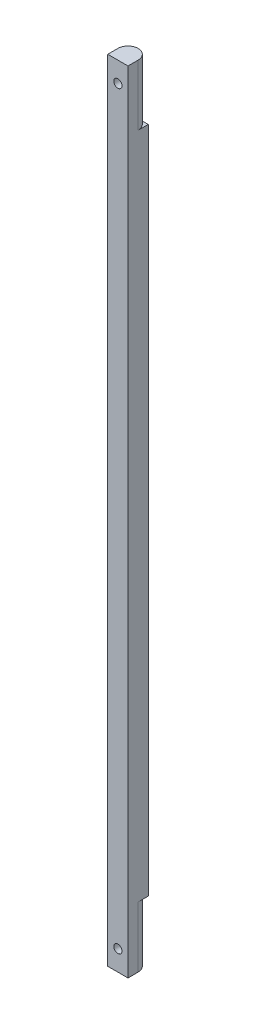
ISO-10303-21;
HEADER;
FILE_DESCRIPTION(('STEP AP214'),'2;1');
FILE_NAME('part.step','',(''),(''),'','','');
FILE_SCHEMA(('AUTOMOTIVE_DESIGN { 1 0 10303 214 1 1 1 1 }'));
ENDSEC;
DATA;
#1=APPLICATION_CONTEXT('core data for automotive mechanical design processes');
#2=APPLICATION_PROTOCOL_DEFINITION('international standard','automotive_design',2000,#1);
#3=PRODUCT_CONTEXT('',#1,'mechanical');
#4=PRODUCT('Part','Part','',(#3));
#5=PRODUCT_RELATED_PRODUCT_CATEGORY('part','',(#4));
#6=PRODUCT_DEFINITION_FORMATION('','',#4);
#7=PRODUCT_DEFINITION_CONTEXT('part definition',#1,'design');
#8=PRODUCT_DEFINITION('design','',#6,#7);
#9=PRODUCT_DEFINITION_SHAPE('','',#8);
#10=(LENGTH_UNIT() NAMED_UNIT(*) SI_UNIT(.MILLI.,.METRE.));
#11=(NAMED_UNIT(*) PLANE_ANGLE_UNIT() SI_UNIT($,.RADIAN.));
#12=(NAMED_UNIT(*) SI_UNIT($,.STERADIAN.) SOLID_ANGLE_UNIT());
#13=UNCERTAINTY_MEASURE_WITH_UNIT(LENGTH_MEASURE(1.E-05),#10,'distance_accuracy_value','');
#14=(GEOMETRIC_REPRESENTATION_CONTEXT(3) GLOBAL_UNCERTAINTY_ASSIGNED_CONTEXT((#13)) GLOBAL_UNIT_ASSIGNED_CONTEXT((#10,
#11,#12)) REPRESENTATION_CONTEXT('',''));
#15=CARTESIAN_POINT('',(0.,0.,0.));
#16=DIRECTION('',(0.,0.,1.));
#17=DIRECTION('',(1.,0.,0.));
#18=AXIS2_PLACEMENT_3D('',#15,#16,#17);
#19=CARTESIAN_POINT('',(0.,123.825,-3.175));
#20=DIRECTION('',(0.,-1.,0.));
#21=DIRECTION('',(0.,0.,-1.));
#22=AXIS2_PLACEMENT_3D('',#19,#20,#21);
#23=CYLINDRICAL_SURFACE('',#22,3.175);
#24=CARTESIAN_POINT('',(0.,116.18595,-6.35));
#25=CARTESIAN_POINT('',(0.0691991170808229,116.185956788068,-6.34999494878284));
#26=CARTESIAN_POINT('',(0.138514448645238,116.191555341976,-6.34771128002319));
#27=CARTESIAN_POINT('',(0.275187458737668,116.213754018676,-6.33879808003825));
#28=CARTESIAN_POINT('',(0.342539383129636,116.230383631502,-6.33215690011809));
#29=CARTESIAN_POINT('',(0.473087021310062,116.273935839912,-6.31524364494565));
#30=CARTESIAN_POINT('',(0.536295708180401,116.300824312642,-6.30498361510931));
#31=CARTESIAN_POINT('',(0.657246364636683,116.363993653507,-6.28183907891045));
#32=CARTESIAN_POINT('',(0.714990136684526,116.400271409981,-6.26895544232704));
#33=CARTESIAN_POINT('',(0.826242629051796,116.48303798756,-6.24116693926225));
#34=CARTESIAN_POINT('',(0.879453289167616,116.529905806007,-6.22619808843745));
#35=CARTESIAN_POINT('',(0.977512911869515,116.631721710038,-6.19621300876413));
#36=CARTESIAN_POINT('',(1.02235767455051,116.686673829532,-6.18119675994665));
#37=CARTESIAN_POINT('',(1.10445361995858,116.806176975847,-6.15204466177736));
#38=CARTESIAN_POINT('',(1.14125872964486,116.871053999478,-6.13798144758871));
#39=CARTESIAN_POINT('',(1.20330090876947,117.006733466404,-6.11333536275321));
#40=CARTESIAN_POINT('',(1.22854363847174,117.077532990269,-6.10275078988582));
#41=CARTESIAN_POINT('',(1.26552995014933,117.219620296577,-6.08694932324813));
#42=CARTESIAN_POINT('',(1.27784529118986,117.290733156439,-6.08150625748732));
#43=CARTESIAN_POINT('',(1.29041253820246,117.434208322782,-6.07595030426477));
#44=CARTESIAN_POINT('',(1.29067062652423,117.506569969908,-6.07583468515811));
#45=CARTESIAN_POINT('',(1.27954838927626,117.644924216132,-6.08075429064617));
#46=CARTESIAN_POINT('',(1.26900566717996,117.710999922727,-6.08541882210552));
#47=CARTESIAN_POINT('',(1.23798066165121,117.840347861588,-6.0987494612119));
#48=CARTESIAN_POINT('',(1.21749658508013,117.903619585847,-6.10741629074641));
#49=CARTESIAN_POINT('',(1.16677664432287,118.027116233062,-6.12796740817153));
#50=CARTESIAN_POINT('',(1.13634738556802,118.087250778693,-6.13991468325851));
#51=CARTESIAN_POINT('',(1.06673695185948,118.201785820865,-6.16566416352443));
#52=CARTESIAN_POINT('',(1.02755242891495,118.256184112133,-6.17946707748857));
#53=CARTESIAN_POINT('',(0.937867550666348,118.362273896899,-6.20871449812304));
#54=CARTESIAN_POINT('',(0.886713453390287,118.413402375971,-6.22420207670568));
#55=CARTESIAN_POINT('',(0.776396004733478,118.506538369481,-6.25413921024311));
#56=CARTESIAN_POINT('',(0.717230965144648,118.548543956509,-6.2685885454157));
#57=CARTESIAN_POINT('',(0.590933707198551,118.623011119083,-6.29520310800086));
#58=CARTESIAN_POINT('',(0.523660769986689,118.655254776155,-6.30731426034368));
#59=CARTESIAN_POINT('',(0.384028809868175,118.707772211686,-6.327476877027));
#60=CARTESIAN_POINT('',(0.311672473755064,118.728052260945,-6.33553046784028));
#61=CARTESIAN_POINT('',(0.168641898681412,118.754914035715,-6.34627953592641));
#62=CARTESIAN_POINT('',(0.0981318255811727,118.762252010128,-6.34927037549045));
#63=CARTESIAN_POINT('',(-0.0431691778579922,118.765262047857,-6.35049175469347));
#64=CARTESIAN_POINT('',(-0.113960027542253,118.760937248841,-6.34872357466488));
#65=CARTESIAN_POINT('',(-0.250344995389924,118.741295473728,-6.34081834382161));
#66=CARTESIAN_POINT('',(-0.316027571427211,118.726499988219,-6.33488866781712));
#67=CARTESIAN_POINT('',(-0.443913481919017,118.687052163847,-6.31947407528921));
#68=CARTESIAN_POINT('',(-0.506116370652858,118.662398565518,-6.30998870450208));
#69=CARTESIAN_POINT('',(-0.627434557573657,118.603128626758,-6.28801625437917));
#70=CARTESIAN_POINT('',(-0.686395814260261,118.568228899906,-6.27544574313742));
#71=CARTESIAN_POINT('',(-0.79783382236026,118.489770625462,-6.24865843400418));
#72=CARTESIAN_POINT('',(-0.850307918909783,118.446208551713,-6.23444096667786));
#73=CARTESIAN_POINT('',(-0.951026543140727,118.348192421997,-6.20470562715203));
#74=CARTESIAN_POINT('',(-0.998741114888621,118.293199271231,-6.18916505256559));
#75=CARTESIAN_POINT('',(-1.08440104458421,118.175720856224,-6.15941967611857));
#76=CARTESIAN_POINT('',(-1.12234458519762,118.113234201413,-6.1452151230588));
#77=CARTESIAN_POINT('',(-1.18768318457142,117.981480569898,-6.11970431782529));
#78=CARTESIAN_POINT('',(-1.21495482686029,117.912145249523,-6.10843245344576));
#79=CARTESIAN_POINT('',(-1.25721698429187,117.769268559694,-6.09057314753681));
#80=CARTESIAN_POINT('',(-1.2722169384638,117.69573046956,-6.08398210616891));
#81=CARTESIAN_POINT('',(-1.28859508015926,117.552382904157,-6.07676160650549));
#82=CARTESIAN_POINT('',(-1.2908967198223,117.482698691789,-6.07572814139085));
#83=CARTESIAN_POINT('',(-1.28425228510169,117.343983779239,-6.07867601428325));
#84=CARTESIAN_POINT('',(-1.27530773909969,117.274952991539,-6.08265667086014));
#85=CARTESIAN_POINT('',(-1.24718689304565,117.142479218033,-6.09482321951612));
#86=CARTESIAN_POINT('',(-1.22845580313664,117.078923309118,-6.10282559452905));
#87=CARTESIAN_POINT('',(-1.18171667348738,116.955834512828,-6.12199939284952));
#88=CARTESIAN_POINT('',(-1.15370605515247,116.896302749225,-6.1331716968927));
#89=CARTESIAN_POINT('',(-1.08731746525223,116.779166820985,-6.15823530583221));
#90=CARTESIAN_POINT('',(-1.04843009803694,116.721877607109,-6.17224719173308));
#91=CARTESIAN_POINT('',(-0.96212525088794,116.614348306853,-6.20105482524189));
#92=CARTESIAN_POINT('',(-0.9147050595382,116.564110470199,-6.21585082095353));
#93=CARTESIAN_POINT('',(-0.808865748077677,116.46861939811,-6.24576238710602));
#94=CARTESIAN_POINT('',(-0.749919587011663,116.423933241831,-6.26083186881097));
#95=CARTESIAN_POINT('',(-0.624798009827087,116.345069019544,-6.28857548380923));
#96=CARTESIAN_POINT('',(-0.55861928058083,116.310895796925,-6.30124851200542));
#97=CARTESIAN_POINT('',(-0.422063336305991,116.254809152999,-6.3225671606999));
#98=CARTESIAN_POINT('',(-0.351782819012527,116.232686658881,-6.33128099638565));
#99=CARTESIAN_POINT('',(-0.208203856400565,116.200765168937,-6.34397908859924));
#100=CARTESIAN_POINT('',(-0.13491570747754,116.190927247903,-6.34797828179879));
#101=CARTESIAN_POINT('',(-0.0409571719211323,116.186435944817,-6.34980333267174));
#102=CARTESIAN_POINT('',(-0.0204836774519322,116.185947990659,-6.35000149521421));
#103=CARTESIAN_POINT('',(0.,116.18595,-6.35));
#104=B_SPLINE_CURVE_WITH_KNOTS('',3,(#24,#25,#26,#27,#28,#29,#30,#31,#32,#33,#34,#35,#36,#37,
#38,#39,#40,#41,#42,#43,#44,#45,#46,#47,#48,#49,#50,#51,#52,#53,#54,#55,#56,#57,#58,#59,#60,#61,
#62,#63,#64,#65,#66,#67,#68,#69,#70,#71,#72,#73,#74,#75,#76,#77,#78,#79,#80,#81,#82,#83,#84,#85,
#86,#87,#88,#89,#90,#91,#92,#93,#94,#95,#96,#97,#98,#99,#100,#101,#102,#103),.UNSPECIFIED.,.T.,
.F.,(4,2,2,2,2,2,2,2,2,2,2,2,2,2,2,2,2,2,2,2,2,2,2,2,2,2,2,2,2,2,2,2,2,2,2,2,2,2,2,4),(0.,
0.2075413266167,0.415639734921062,0.623051920280876,0.8303954558898,1.04686045974,
1.26343384409847,1.49000426712626,1.71646365569269,1.93242050038483,2.14826661210773,
2.34855365224723,2.54887683192717,2.7533536718053,2.9579088373367,3.1787983054186,
3.39973439591492,3.62529000925708,3.85072729091377,4.06249091564621,4.27419757470954,
4.47604123804456,4.67791069704711,4.88599585529143,5.09416589223805,5.31648608861492,
5.53884760496836,5.76370959278774,5.98839846019681,6.19650800502097,6.40458927035164,
6.60393683866939,6.80333984820439,7.01437321947173,7.22547376814521,7.45085448578607,
7.67633888306081,7.89777542509607,8.1185085224396,8.17994297090802),.UNSPECIFIED.);
#105=CARTESIAN_POINT('',(0.,116.18595,-6.35));
#106=VERTEX_POINT('',#105);
#107=EDGE_CURVE('E12',#106,#106,#104,.T.);
#108=ORIENTED_EDGE('',*,*,#107,.T.);
#109=EDGE_LOOP('',(#108));
#110=FACE_BOUND('',#109,.T.);
#111=CARTESIAN_POINT('',(0.,104.775,-3.175));
#112=DIRECTION('',(0.,-1.,0.));
#113=DIRECTION('',(0.,0.,-1.));
#114=AXIS2_PLACEMENT_3D('',#111,#112,#113);
#115=CIRCLE('',#114,3.175);
#116=CARTESIAN_POINT('',(0.,104.775,-6.35));
#117=VERTEX_POINT('',#116);
#118=CARTESIAN_POINT('',(3.175,104.775,-3.175));
#119=VERTEX_POINT('',#118);
#120=EDGE_CURVE('E176',#117,#119,#115,.T.);
#121=ORIENTED_EDGE('',*,*,#120,.F.);
#122=CARTESIAN_POINT('',(-3.175,104.775,-3.175));
#123=VERTEX_POINT('',#122);
#124=EDGE_CURVE('E138',#123,#117,#115,.T.);
#125=ORIENTED_EDGE('',*,*,#124,.F.);
#126=DIRECTION('',(0.,-1.,0.));
#127=VECTOR('',#126,1.);
#128=CARTESIAN_POINT('',(-3.175,123.825,-3.175));
#129=LINE('',#128,#127);
#130=CARTESIAN_POINT('',(-3.175,123.825,-3.175));
#131=VERTEX_POINT('',#130);
#132=EDGE_CURVE('E157',#131,#123,#129,.T.);
#133=ORIENTED_EDGE('',*,*,#132,.F.);
#134=CARTESIAN_POINT('',(0.,123.825,-3.175));
#135=DIRECTION('',(0.,1.,0.));
#136=DIRECTION('',(0.,0.,-1.));
#137=AXIS2_PLACEMENT_3D('',#134,#135,#136);
#138=CIRCLE('',#137,3.175);
#139=CARTESIAN_POINT('',(3.175,123.825,-3.175));
#140=VERTEX_POINT('',#139);
#141=EDGE_CURVE('E191',#140,#131,#138,.T.);
#142=ORIENTED_EDGE('',*,*,#141,.F.);
#143=DIRECTION('',(0.,-1.,0.));
#144=VECTOR('',#143,1.);
#145=CARTESIAN_POINT('',(3.175,123.825,-3.175));
#146=LINE('',#145,#144);
#147=EDGE_CURVE('E213',#140,#119,#146,.T.);
#148=ORIENTED_EDGE('',*,*,#147,.T.);
#149=EDGE_LOOP('',(#121,#125,#133,#142,#148));
#150=FACE_BOUND('',#149,.T.);
#151=ADVANCED_FACE('F45',(#110,#150),#23,.T.);
#152=CARTESIAN_POINT('',(0.,-118.76405,-6.35));
#153=CARTESIAN_POINT('',(0.0691991170808229,-118.764043211932,-6.34999494878284));
#154=CARTESIAN_POINT('',(0.138514448645238,-118.758444658024,-6.34771128002319));
#155=CARTESIAN_POINT('',(0.275187458737668,-118.736245981324,-6.33879808003825));
#156=CARTESIAN_POINT('',(0.342539383129636,-118.719616368498,-6.33215690011809));
#157=CARTESIAN_POINT('',(0.473087021310062,-118.676064160088,-6.31524364494565));
#158=CARTESIAN_POINT('',(0.536295708180401,-118.649175687358,-6.30498361510931));
#159=CARTESIAN_POINT('',(0.657246364636683,-118.586006346493,-6.28183907891045));
#160=CARTESIAN_POINT('',(0.714990136684526,-118.549728590019,-6.26895544232704));
#161=CARTESIAN_POINT('',(0.826242629051796,-118.46696201244,-6.24116693926225));
#162=CARTESIAN_POINT('',(0.879453289167616,-118.420094193993,-6.22619808843745));
#163=CARTESIAN_POINT('',(0.977512911869515,-118.318278289962,-6.19621300876413));
#164=CARTESIAN_POINT('',(1.02235767455051,-118.263326170468,-6.18119675994665));
#165=CARTESIAN_POINT('',(1.10445361995858,-118.143823024153,-6.15204466177736));
#166=CARTESIAN_POINT('',(1.14125872964486,-118.078946000522,-6.13798144758871));
#167=CARTESIAN_POINT('',(1.20330090876947,-117.943266533596,-6.11333536275321));
#168=CARTESIAN_POINT('',(1.22854363847174,-117.872467009731,-6.10275078988582));
#169=CARTESIAN_POINT('',(1.26552995014933,-117.730379703423,-6.08694932324813));
#170=CARTESIAN_POINT('',(1.27784529118986,-117.659266843561,-6.08150625748732));
#171=CARTESIAN_POINT('',(1.29041253820246,-117.515791677218,-6.07595030426477));
#172=CARTESIAN_POINT('',(1.29067062652423,-117.443430030092,-6.07583468515811));
#173=CARTESIAN_POINT('',(1.27954838927626,-117.305075783868,-6.08075429064617));
#174=CARTESIAN_POINT('',(1.26900566717996,-117.239000077273,-6.08541882210551));
#175=CARTESIAN_POINT('',(1.23798066165121,-117.109652138412,-6.09874946121189));
#176=CARTESIAN_POINT('',(1.21749658508013,-117.046380414153,-6.10741629074641));
#177=CARTESIAN_POINT('',(1.16677664432287,-116.922883766938,-6.12796740817153));
#178=CARTESIAN_POINT('',(1.13634738556802,-116.862749221307,-6.13991468325851));
#179=CARTESIAN_POINT('',(1.06673695185948,-116.748214179135,-6.16566416352443));
#180=CARTESIAN_POINT('',(1.02755242891495,-116.693815887866,-6.17946707748857));
#181=CARTESIAN_POINT('',(0.937867550666344,-116.587726103101,-6.20871449812304));
#182=CARTESIAN_POINT('',(0.886713453390279,-116.536597624029,-6.22420207670569));
#183=CARTESIAN_POINT('',(0.776396004733469,-116.443461630519,-6.25413921024311));
#184=CARTESIAN_POINT('',(0.717230965144644,-116.401456043491,-6.2685885454157));
#185=CARTESIAN_POINT('',(0.590933707198547,-116.326988880917,-6.29520310800086));
#186=CARTESIAN_POINT('',(0.52366076998668,-116.294745223845,-6.30731426034368));
#187=CARTESIAN_POINT('',(0.384028809868165,-116.242227788314,-6.32747687702701));
#188=CARTESIAN_POINT('',(0.31167247375506,-116.221947739054,-6.33553046784028));
#189=CARTESIAN_POINT('',(0.168641898681413,-116.195085964285,-6.34627953592641));
#190=CARTESIAN_POINT('',(0.0981318255811732,-116.187747989872,-6.34927037549045));
#191=CARTESIAN_POINT('',(-0.0431691778579919,-116.184737952143,-6.35049175469347));
#192=CARTESIAN_POINT('',(-0.113960027542253,-116.189062751159,-6.34872357466488));
#193=CARTESIAN_POINT('',(-0.250344995389924,-116.208704526272,-6.34081834382161));
#194=CARTESIAN_POINT('',(-0.316027571427211,-116.223500011781,-6.33488866781712));
#195=CARTESIAN_POINT('',(-0.443913481919017,-116.262947836153,-6.31947407528921));
#196=CARTESIAN_POINT('',(-0.506116370652858,-116.287601434482,-6.30998870450208));
#197=CARTESIAN_POINT('',(-0.627434557573657,-116.346871373242,-6.28801625437917));
#198=CARTESIAN_POINT('',(-0.686395814260261,-116.381771100094,-6.27544574313742));
#199=CARTESIAN_POINT('',(-0.79783382236026,-116.460229374538,-6.24865843400418));
#200=CARTESIAN_POINT('',(-0.850307918909783,-116.503791448287,-6.23444096667786));
#201=CARTESIAN_POINT('',(-0.951026543140727,-116.601807578003,-6.20470562715203));
#202=CARTESIAN_POINT('',(-0.998741114888621,-116.656800728769,-6.18916505256559));
#203=CARTESIAN_POINT('',(-1.08440104458421,-116.774279143776,-6.15941967611857));
#204=CARTESIAN_POINT('',(-1.12234458519762,-116.836765798587,-6.1452151230588));
#205=CARTESIAN_POINT('',(-1.18768318457141,-116.968519430102,-6.11970431782529));
#206=CARTESIAN_POINT('',(-1.21495482686028,-117.037854750477,-6.10843245344576));
#207=CARTESIAN_POINT('',(-1.25721698429186,-117.180731440306,-6.09057314753681));
#208=CARTESIAN_POINT('',(-1.2722169384638,-117.25426953044,-6.08398210616892));
#209=CARTESIAN_POINT('',(-1.28859508015926,-117.397617095843,-6.07676160650549));
#210=CARTESIAN_POINT('',(-1.2908967198223,-117.467301308211,-6.07572814139085));
#211=CARTESIAN_POINT('',(-1.28425228510169,-117.606016220761,-6.07867601428325));
#212=CARTESIAN_POINT('',(-1.27530773909969,-117.675047008461,-6.08265667086014));
#213=CARTESIAN_POINT('',(-1.24718689304565,-117.807520781967,-6.09482321951612));
#214=CARTESIAN_POINT('',(-1.22845580313664,-117.871076690882,-6.10282559452905));
#215=CARTESIAN_POINT('',(-1.18171667348738,-117.994165487172,-6.12199939284952));
#216=CARTESIAN_POINT('',(-1.15370605515247,-118.053697250775,-6.1331716968927));
#217=CARTESIAN_POINT('',(-1.08731746525223,-118.170833179015,-6.15823530583221));
#218=CARTESIAN_POINT('',(-1.04843009803694,-118.228122392891,-6.17224719173308));
#219=CARTESIAN_POINT('',(-0.96212525088794,-118.335651693147,-6.20105482524189));
#220=CARTESIAN_POINT('',(-0.9147050595382,-118.385889529801,-6.21585082095353));
#221=CARTESIAN_POINT('',(-0.808865748077677,-118.48138060189,-6.24576238710602));
#222=CARTESIAN_POINT('',(-0.749919587011663,-118.526066758169,-6.26083186881097));
#223=CARTESIAN_POINT('',(-0.624798009827087,-118.604930980456,-6.28857548380923));
#224=CARTESIAN_POINT('',(-0.55861928058083,-118.639104203075,-6.30124851200542));
#225=CARTESIAN_POINT('',(-0.422063336305991,-118.695190847001,-6.3225671606999));
#226=CARTESIAN_POINT('',(-0.351782819012527,-118.717313341119,-6.33128099638565));
#227=CARTESIAN_POINT('',(-0.208203856400565,-118.749234831063,-6.34397908859924));
#228=CARTESIAN_POINT('',(-0.13491570747754,-118.759072752097,-6.34797828179879));
#229=CARTESIAN_POINT('',(-0.0409571719211323,-118.763564055183,-6.34980333267174));
#230=CARTESIAN_POINT('',(-0.0204836774519322,-118.764052009341,-6.35000149521421));
#231=CARTESIAN_POINT('',(0.,-118.76405,-6.35));
#232=B_SPLINE_CURVE_WITH_KNOTS('',3,(#152,#153,#154,#155,#156,#157,#158,#159,#160,#161,#162,
#163,#164,#165,#166,#167,#168,#169,#170,#171,#172,#173,#174,#175,#176,#177,#178,#179,#180,#181,
#182,#183,#184,#185,#186,#187,#188,#189,#190,#191,#192,#193,#194,#195,#196,#197,#198,#199,#200,
#201,#202,#203,#204,#205,#206,#207,#208,#209,#210,#211,#212,#213,#214,#215,#216,#217,#218,#219,
#220,#221,#222,#223,#224,#225,#226,#227,#228,#229,#230,#231),.UNSPECIFIED.,.T.,.F.,(4,2,2,2,2,2,
2,2,2,2,2,2,2,2,2,2,2,2,2,2,2,2,2,2,2,2,2,2,2,2,2,2,2,2,2,2,2,2,2,4),(0.,0.2075413266167,
0.415639734921062,0.623051920280876,0.8303954558898,1.04686045974,1.26343384409847,
1.49000426712626,1.71646365569269,1.93242050038483,2.14826661210773,2.34855365224722,
2.54887683192717,2.7533536718053,2.9579088373367,3.17879830541862,3.39973439591492,
3.62529000925709,3.85072729091377,4.06249091564621,4.27419757470954,4.47604123804456,
4.67791069704711,4.88599585529143,5.09416589223805,5.31648608861492,5.53884760496836,
5.76370959278772,5.98839846019681,6.19650800502097,6.40458927035164,6.60393683866939,
6.80333984820439,7.01437321947173,7.22547376814521,7.45085448578608,7.67633888306081,
7.89777542509607,8.1185085224396,8.17994297090803),.UNSPECIFIED.);
#233=CARTESIAN_POINT('',(0.,-118.76405,-6.35));
#234=VERTEX_POINT('',#233);
#235=EDGE_CURVE('E59',#234,#234,#232,.T.);
#236=ORIENTED_EDGE('',*,*,#235,.T.);
#237=EDGE_LOOP('',(#236));
#238=FACE_BOUND('',#237,.T.);
#239=CARTESIAN_POINT('',(0.,-104.775,-3.175));
#240=DIRECTION('',(0.,-1.,0.));
#241=DIRECTION('',(0.,0.,-1.));
#242=AXIS2_PLACEMENT_3D('',#239,#240,#241);
#243=CIRCLE('',#242,3.175);
#244=CARTESIAN_POINT('',(-3.175,-104.775,-3.175));
#245=VERTEX_POINT('',#244);
#246=CARTESIAN_POINT('',(0.,-104.775,-6.35));
#247=VERTEX_POINT('',#246);
#248=EDGE_CURVE('E177',#245,#247,#243,.T.);
#249=ORIENTED_EDGE('',*,*,#248,.T.);
#250=CARTESIAN_POINT('',(3.175,-104.775,-3.175));
#251=VERTEX_POINT('',#250);
#252=EDGE_CURVE('E181',#247,#251,#243,.T.);
#253=ORIENTED_EDGE('',*,*,#252,.T.);
#254=CARTESIAN_POINT('',(3.175,-123.825,-3.175));
#255=VERTEX_POINT('',#254);
#256=EDGE_CURVE('E96',#251,#255,#146,.T.);
#257=ORIENTED_EDGE('',*,*,#256,.T.);
#258=CARTESIAN_POINT('',(0.,-123.825,-3.175));
#259=DIRECTION('',(0.,1.,0.));
#260=DIRECTION('',(0.,0.,-1.));
#261=AXIS2_PLACEMENT_3D('',#258,#259,#260);
#262=CIRCLE('',#261,3.175);
#263=CARTESIAN_POINT('',(-3.175,-123.825,-3.175));
#264=VERTEX_POINT('',#263);
#265=EDGE_CURVE('E190',#255,#264,#262,.T.);
#266=ORIENTED_EDGE('',*,*,#265,.T.);
#267=EDGE_CURVE('E223',#245,#264,#129,.T.);
#268=ORIENTED_EDGE('',*,*,#267,.F.);
#269=EDGE_LOOP('',(#249,#253,#257,#266,#268));
#270=FACE_BOUND('',#269,.T.);
#271=ADVANCED_FACE('F47',(#238,#270),#23,.T.);
#272=CARTESIAN_POINT('',(-3.175,123.825,-3.175));
#273=DIRECTION('',(1.,0.,0.));
#274=DIRECTION('',(0.,0.,-1.));
#275=AXIS2_PLACEMENT_3D('',#272,#273,#274);
#276=PLANE('',#275);
#277=DIRECTION('',(0.,0.,1.));
#278=VECTOR('',#277,1.);
#279=CARTESIAN_POINT('',(-3.175,-123.825,-3.175));
#280=LINE('',#279,#278);
#281=CARTESIAN_POINT('',(-3.175,-123.825,0.));
#282=VERTEX_POINT('',#281);
#283=EDGE_CURVE('E204',#264,#282,#280,.T.);
#284=ORIENTED_EDGE('',*,*,#283,.T.);
#285=DIRECTION('',(0.,-1.,0.));
#286=VECTOR('',#285,1.);
#287=CARTESIAN_POINT('',(-3.175,123.825,0.));
#288=LINE('',#287,#286);
#289=CARTESIAN_POINT('',(-3.175,123.825,0.));
#290=VERTEX_POINT('',#289);
#291=EDGE_CURVE('E220',#290,#282,#288,.T.);
#292=ORIENTED_EDGE('',*,*,#291,.F.);
#293=DIRECTION('',(0.,0.,1.));
#294=VECTOR('',#293,1.);
#295=CARTESIAN_POINT('',(-3.175,123.825,-3.175));
#296=LINE('',#295,#294);
#297=EDGE_CURVE('E103',#131,#290,#296,.T.);
#298=ORIENTED_EDGE('',*,*,#297,.F.);
#299=ORIENTED_EDGE('',*,*,#132,.T.);
#300=DIRECTION('',(0.,0.,1.));
#301=VECTOR('',#300,1.);
#302=CARTESIAN_POINT('',(-3.175,104.775,-6.35));
#303=LINE('',#302,#301);
#304=CARTESIAN_POINT('',(-3.175,104.775,-6.35));
#305=VERTEX_POINT('',#304);
#306=EDGE_CURVE('E136',#305,#123,#303,.T.);
#307=ORIENTED_EDGE('',*,*,#306,.F.);
#308=DIRECTION('',(0.,1.,0.));
#309=VECTOR('',#308,1.);
#310=CARTESIAN_POINT('',(-3.175,-132.805256121069,-6.35));
#311=LINE('',#310,#309);
#312=CARTESIAN_POINT('',(-3.175,-104.775,-6.35));
#313=VERTEX_POINT('',#312);
#314=EDGE_CURVE('E146',#313,#305,#311,.T.);
#315=ORIENTED_EDGE('',*,*,#314,.F.);
#316=DIRECTION('',(0.,0.,1.));
#317=VECTOR('',#316,1.);
#318=CARTESIAN_POINT('',(-3.175,-104.775,-6.35));
#319=LINE('',#318,#317);
#320=EDGE_CURVE('E66',#313,#245,#319,.T.);
#321=ORIENTED_EDGE('',*,*,#320,.T.);
#322=ORIENTED_EDGE('',*,*,#267,.T.);
#323=EDGE_LOOP('',(#284,#292,#298,#299,#307,#315,#321,#322));
#324=FACE_BOUND('',#323,.T.);
#325=ADVANCED_FACE('F155',(#324),#276,.F.);
#326=CARTESIAN_POINT('',(-3.175,123.825,0.));
#327=DIRECTION('',(0.,0.,-1.));
#328=DIRECTION('',(-1.,0.,0.));
#329=AXIS2_PLACEMENT_3D('',#326,#327,#328);
#330=PLANE('',#329);
#331=CARTESIAN_POINT('',(0.,-117.475,0.));
#332=DIRECTION('',(0.,0.,1.));
#333=DIRECTION('',(1.,0.,0.));
#334=AXIS2_PLACEMENT_3D('',#331,#332,#333);
#335=CIRCLE('',#334,1.28905);
#336=CARTESIAN_POINT('',(1.28905,-117.475,0.));
#337=VERTEX_POINT('',#336);
#338=EDGE_CURVE('E186',#337,#337,#335,.T.);
#339=ORIENTED_EDGE('',*,*,#338,.F.);
#340=EDGE_LOOP('',(#339));
#341=FACE_BOUND('',#340,.T.);
#342=DIRECTION('',(1.,0.,0.));
#343=VECTOR('',#342,1.);
#344=CARTESIAN_POINT('',(-3.175,-123.825,0.));
#345=LINE('',#344,#343);
#346=CARTESIAN_POINT('',(3.175,-123.825,0.));
#347=VERTEX_POINT('',#346);
#348=EDGE_CURVE('E207',#282,#347,#345,.T.);
#349=ORIENTED_EDGE('',*,*,#348,.T.);
#350=DIRECTION('',(0.,-1.,0.));
#351=VECTOR('',#350,1.);
#352=CARTESIAN_POINT('',(3.175,123.825,0.));
#353=LINE('',#352,#351);
#354=CARTESIAN_POINT('',(3.175,123.825,0.));
#355=VERTEX_POINT('',#354);
#356=EDGE_CURVE('E217',#355,#347,#353,.T.);
#357=ORIENTED_EDGE('',*,*,#356,.F.);
#358=DIRECTION('',(1.,0.,0.));
#359=VECTOR('',#358,1.);
#360=CARTESIAN_POINT('',(-3.175,123.825,0.));
#361=LINE('',#360,#359);
#362=EDGE_CURVE('E197',#290,#355,#361,.T.);
#363=ORIENTED_EDGE('',*,*,#362,.F.);
#364=ORIENTED_EDGE('',*,*,#291,.T.);
#365=EDGE_LOOP('',(#349,#357,#363,#364));
#366=FACE_BOUND('',#365,.T.);
#367=CARTESIAN_POINT('',(0.,117.475,0.));
#368=DIRECTION('',(0.,0.,1.));
#369=DIRECTION('',(1.,0.,0.));
#370=AXIS2_PLACEMENT_3D('',#367,#368,#369);
#371=CIRCLE('',#370,1.28905);
#372=CARTESIAN_POINT('',(1.28905,117.475,0.));
#373=VERTEX_POINT('',#372);
#374=EDGE_CURVE('E182',#373,#373,#371,.T.);
#375=ORIENTED_EDGE('',*,*,#374,.F.);
#376=EDGE_LOOP('',(#375));
#377=FACE_BOUND('',#376,.T.);
#378=ADVANCED_FACE('F249',(#341,#366,#377),#330,.F.);
#379=CARTESIAN_POINT('',(3.175,123.825,0.));
#380=DIRECTION('',(-1.,0.,0.));
#381=DIRECTION('',(0.,0.,1.));
#382=AXIS2_PLACEMENT_3D('',#379,#380,#381);
#383=PLANE('',#382);
#384=ORIENTED_EDGE('',*,*,#256,.F.);
#385=DIRECTION('',(0.,0.,-1.));
#386=VECTOR('',#385,1.);
#387=CARTESIAN_POINT('',(3.175,-104.775,-6.35));
#388=LINE('',#387,#386);
#389=CARTESIAN_POINT('',(3.175,-104.775,-6.35));
#390=VERTEX_POINT('',#389);
#391=EDGE_CURVE('E167',#251,#390,#388,.T.);
#392=ORIENTED_EDGE('',*,*,#391,.T.);
#393=DIRECTION('',(0.,1.,0.));
#394=VECTOR('',#393,1.);
#395=CARTESIAN_POINT('',(3.175,-132.805256121069,-6.35));
#396=LINE('',#395,#394);
#397=CARTESIAN_POINT('',(3.175,104.775,-6.35));
#398=VERTEX_POINT('',#397);
#399=EDGE_CURVE('E169',#390,#398,#396,.T.);
#400=ORIENTED_EDGE('',*,*,#399,.T.);
#401=DIRECTION('',(0.,0.,-1.));
#402=VECTOR('',#401,1.);
#403=CARTESIAN_POINT('',(3.175,104.775,-6.35));
#404=LINE('',#403,#402);
#405=EDGE_CURVE('E144',#119,#398,#404,.T.);
#406=ORIENTED_EDGE('',*,*,#405,.F.);
#407=ORIENTED_EDGE('',*,*,#147,.F.);
#408=DIRECTION('',(0.,0.,-1.));
#409=VECTOR('',#408,1.);
#410=CARTESIAN_POINT('',(3.175,123.825,0.));
#411=LINE('',#410,#409);
#412=EDGE_CURVE('E75',#355,#140,#411,.T.);
#413=ORIENTED_EDGE('',*,*,#412,.F.);
#414=ORIENTED_EDGE('',*,*,#356,.T.);
#415=DIRECTION('',(0.,0.,-1.));
#416=VECTOR('',#415,1.);
#417=CARTESIAN_POINT('',(3.175,-123.825,0.));
#418=LINE('',#417,#416);
#419=EDGE_CURVE('E194',#347,#255,#418,.T.);
#420=ORIENTED_EDGE('',*,*,#419,.T.);
#421=EDGE_LOOP('',(#384,#392,#400,#406,#407,#413,#414,#420));
#422=FACE_BOUND('',#421,.T.);
#423=ADVANCED_FACE('F243',(#422),#383,.F.);
#424=CARTESIAN_POINT('',(0.,123.825,-3.175));
#425=DIRECTION('',(0.,-1.,0.));
#426=DIRECTION('',(0.,0.,-1.));
#427=AXIS2_PLACEMENT_3D('',#424,#425,#426);
#428=PLANE('',#427);
#429=ORIENTED_EDGE('',*,*,#141,.T.);
#430=ORIENTED_EDGE('',*,*,#297,.T.);
#431=ORIENTED_EDGE('',*,*,#362,.T.);
#432=ORIENTED_EDGE('',*,*,#412,.T.);
#433=EDGE_LOOP('',(#429,#430,#431,#432));
#434=FACE_BOUND('',#433,.T.);
#435=ADVANCED_FACE('F240',(#434),#428,.F.);
#436=CARTESIAN_POINT('',(0.,-123.825,-3.175));
#437=DIRECTION('',(0.,-1.,0.));
#438=DIRECTION('',(0.,0.,-1.));
#439=AXIS2_PLACEMENT_3D('',#436,#437,#438);
#440=PLANE('',#439);
#441=ORIENTED_EDGE('',*,*,#265,.F.);
#442=ORIENTED_EDGE('',*,*,#419,.F.);
#443=ORIENTED_EDGE('',*,*,#348,.F.);
#444=ORIENTED_EDGE('',*,*,#283,.F.);
#445=EDGE_LOOP('',(#441,#442,#443,#444));
#446=FACE_BOUND('',#445,.T.);
#447=ADVANCED_FACE('F236',(#446),#440,.T.);
#448=CARTESIAN_POINT('',(0.,-117.475,0.));
#449=DIRECTION('',(0.,0.,1.));
#450=DIRECTION('',(1.,0.,0.));
#451=AXIS2_PLACEMENT_3D('',#448,#449,#450);
#452=CYLINDRICAL_SURFACE('',#451,1.28905);
#453=ORIENTED_EDGE('',*,*,#338,.T.);
#454=EDGE_LOOP('',(#453));
#455=FACE_BOUND('',#454,.T.);
#456=ORIENTED_EDGE('',*,*,#235,.F.);
#457=EDGE_LOOP('',(#456));
#458=FACE_BOUND('',#457,.T.);
#459=ADVANCED_FACE('F231',(#455,#458),#452,.F.);
#460=CARTESIAN_POINT('',(0.,117.475,0.));
#461=DIRECTION('',(0.,0.,1.));
#462=DIRECTION('',(1.,0.,0.));
#463=AXIS2_PLACEMENT_3D('',#460,#461,#462);
#464=CYLINDRICAL_SURFACE('',#463,1.28905);
#465=ORIENTED_EDGE('',*,*,#374,.T.);
#466=EDGE_LOOP('',(#465));
#467=FACE_BOUND('',#466,.T.);
#468=ORIENTED_EDGE('',*,*,#107,.F.);
#469=EDGE_LOOP('',(#468));
#470=FACE_BOUND('',#469,.T.);
#471=ADVANCED_FACE('F235',(#467,#470),#464,.F.);
#472=CARTESIAN_POINT('',(3.175,-132.805256121069,-6.35));
#473=DIRECTION('',(0.,0.,-1.));
#474=DIRECTION('',(-1.,0.,0.));
#475=AXIS2_PLACEMENT_3D('',#472,#473,#474);
#476=PLANE('',#475);
#477=DIRECTION('',(-1.,0.,0.));
#478=VECTOR('',#477,1.);
#479=CARTESIAN_POINT('',(3.175,-104.775,-6.35));
#480=LINE('',#479,#478);
#481=EDGE_CURVE('E152',#390,#247,#480,.T.);
#482=ORIENTED_EDGE('',*,*,#481,.T.);
#483=EDGE_CURVE('E150',#247,#313,#480,.T.);
#484=ORIENTED_EDGE('',*,*,#483,.T.);
#485=ORIENTED_EDGE('',*,*,#314,.T.);
#486=DIRECTION('',(-1.,0.,0.));
#487=VECTOR('',#486,1.);
#488=CARTESIAN_POINT('',(3.175,104.775,-6.35));
#489=LINE('',#488,#487);
#490=EDGE_CURVE('E132',#117,#305,#489,.T.);
#491=ORIENTED_EDGE('',*,*,#490,.F.);
#492=EDGE_CURVE('E143',#398,#117,#489,.T.);
#493=ORIENTED_EDGE('',*,*,#492,.F.);
#494=ORIENTED_EDGE('',*,*,#399,.F.);
#495=EDGE_LOOP('',(#482,#484,#485,#491,#493,#494));
#496=FACE_BOUND('',#495,.T.);
#497=ADVANCED_FACE('F148',(#496),#476,.T.);
#498=CARTESIAN_POINT('',(0.,-104.775,-3.175));
#499=DIRECTION('',(0.,-1.,0.));
#500=DIRECTION('',(0.,0.,-1.));
#501=AXIS2_PLACEMENT_3D('',#498,#499,#500);
#502=PLANE('',#501);
#503=ORIENTED_EDGE('',*,*,#252,.F.);
#504=ORIENTED_EDGE('',*,*,#481,.F.);
#505=ORIENTED_EDGE('',*,*,#391,.F.);
#506=EDGE_LOOP('',(#503,#504,#505));
#507=FACE_BOUND('',#506,.T.);
#508=ADVANCED_FACE('F278',(#507),#502,.T.);
#509=ORIENTED_EDGE('',*,*,#248,.F.);
#510=ORIENTED_EDGE('',*,*,#320,.F.);
#511=ORIENTED_EDGE('',*,*,#483,.F.);
#512=EDGE_LOOP('',(#509,#510,#511));
#513=FACE_BOUND('',#512,.T.);
#514=ADVANCED_FACE('F280',(#513),#502,.T.);
#515=CARTESIAN_POINT('',(0.,104.775,0.));
#516=DIRECTION('',(0.,-1.,0.));
#517=DIRECTION('',(0.,0.,-1.));
#518=AXIS2_PLACEMENT_3D('',#515,#516,#517);
#519=PLANE('',#518);
#520=ORIENTED_EDGE('',*,*,#492,.T.);
#521=ORIENTED_EDGE('',*,*,#120,.T.);
#522=ORIENTED_EDGE('',*,*,#405,.T.);
#523=EDGE_LOOP('',(#520,#521,#522));
#524=FACE_BOUND('',#523,.T.);
#525=ADVANCED_FACE('F274',(#524),#519,.F.);
#526=ORIENTED_EDGE('',*,*,#306,.T.);
#527=ORIENTED_EDGE('',*,*,#124,.T.);
#528=ORIENTED_EDGE('',*,*,#490,.T.);
#529=EDGE_LOOP('',(#526,#527,#528));
#530=FACE_BOUND('',#529,.T.);
#531=ADVANCED_FACE('F134',(#530),#519,.F.);
#532=CLOSED_SHELL('',(#151,#271,#325,#378,#423,#435,#447,#459,#471,#497,#508,#514,#525,#531));
#533=MANIFOLD_SOLID_BREP('B2',#532);
#534=ADVANCED_BREP_SHAPE_REPRESENTATION('',(#18,#533),#14);
#535=SHAPE_DEFINITION_REPRESENTATION(#9,#534);
ENDSEC;
END-ISO-10303-21;
